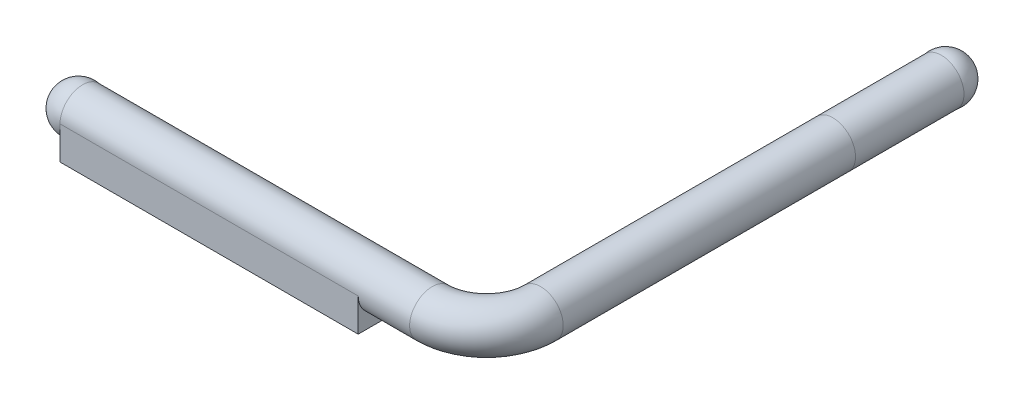
ISO-10303-21;
HEADER;
FILE_DESCRIPTION(('STEP AP214'),'2;1');
FILE_NAME('part.step','',(''),(''),'','','');
FILE_SCHEMA(('AUTOMOTIVE_DESIGN { 1 0 10303 214 1 1 1 1 }'));
ENDSEC;
DATA;
#1=APPLICATION_CONTEXT('core data for automotive mechanical design processes');
#2=APPLICATION_PROTOCOL_DEFINITION('international standard','automotive_design',2000,#1);
#3=PRODUCT_CONTEXT('',#1,'mechanical');
#4=PRODUCT('Part','Part','',(#3));
#5=PRODUCT_RELATED_PRODUCT_CATEGORY('part','',(#4));
#6=PRODUCT_DEFINITION_FORMATION('','',#4);
#7=PRODUCT_DEFINITION_CONTEXT('part definition',#1,'design');
#8=PRODUCT_DEFINITION('design','',#6,#7);
#9=PRODUCT_DEFINITION_SHAPE('','',#8);
#10=(LENGTH_UNIT() NAMED_UNIT(*) SI_UNIT(.MILLI.,.METRE.));
#11=(NAMED_UNIT(*) PLANE_ANGLE_UNIT() SI_UNIT($,.RADIAN.));
#12=(NAMED_UNIT(*) SI_UNIT($,.STERADIAN.) SOLID_ANGLE_UNIT());
#13=UNCERTAINTY_MEASURE_WITH_UNIT(LENGTH_MEASURE(1.E-05),#10,'distance_accuracy_value','');
#14=(GEOMETRIC_REPRESENTATION_CONTEXT(3) GLOBAL_UNCERTAINTY_ASSIGNED_CONTEXT((#13)) GLOBAL_UNIT_ASSIGNED_CONTEXT((#10,
#11,#12)) REPRESENTATION_CONTEXT('',''));
#15=CARTESIAN_POINT('',(0.,0.,0.));
#16=DIRECTION('',(0.,0.,1.));
#17=DIRECTION('',(1.,0.,0.));
#18=AXIS2_PLACEMENT_3D('',#15,#16,#17);
#19=CARTESIAN_POINT('',(25.,4.,32.35));
#20=DIRECTION('',(0.,0.,-1.));
#21=DIRECTION('',(-1.,0.,0.));
#22=AXIS2_PLACEMENT_3D('',#19,#20,#21);
#23=CYLINDRICAL_SURFACE('',#22,2.49999999999999);
#24=CARTESIAN_POINT('',(25.,4.,32.35));
#25=DIRECTION('',(0.,0.,1.));
#26=DIRECTION('',(1.,0.,0.));
#27=AXIS2_PLACEMENT_3D('',#24,#25,#26);
#28=CIRCLE('',#27,2.49999999999999);
#29=CARTESIAN_POINT('',(27.5,4.,32.35));
#30=VERTEX_POINT('',#29);
#31=EDGE_CURVE('E118',#30,#30,#28,.T.);
#32=ORIENTED_EDGE('',*,*,#31,.F.);
#33=EDGE_LOOP('',(#32));
#34=FACE_BOUND('',#33,.T.);
#35=CARTESIAN_POINT('',(25.,4.,0.));
#36=DIRECTION('',(0.,0.,1.));
#37=DIRECTION('',(1.,0.,0.));
#38=AXIS2_PLACEMENT_3D('',#35,#36,#37);
#39=CIRCLE('',#38,2.49999999999999);
#40=CARTESIAN_POINT('',(27.5,4.,0.));
#41=VERTEX_POINT('',#40);
#42=EDGE_CURVE('E11',#41,#41,#39,.T.);
#43=ORIENTED_EDGE('',*,*,#42,.T.);
#44=EDGE_LOOP('',(#43));
#45=FACE_BOUND('',#44,.T.);
#46=ADVANCED_FACE('F41',(#34,#45),#23,.T.);
#47=CARTESIAN_POINT('',(19.,4.,38.35));
#48=DIRECTION('',(-1.,0.,0.));
#49=DIRECTION('',(0.,0.,1.));
#50=AXIS2_PLACEMENT_3D('',#47,#48,#49);
#51=CYLINDRICAL_SURFACE('',#50,2.49999999999999);
#52=CARTESIAN_POINT('',(19.,4.,38.35));
#53=DIRECTION('',(-1.,0.,0.));
#54=DIRECTION('',(0.,0.,1.));
#55=AXIS2_PLACEMENT_3D('',#52,#53,#54);
#56=CIRCLE('',#55,2.49999999999999);
#57=CARTESIAN_POINT('',(19.,4.,40.85));
#58=VERTEX_POINT('',#57);
#59=EDGE_CURVE('E121',#58,#58,#56,.T.);
#60=ORIENTED_EDGE('',*,*,#59,.T.);
#61=EDGE_LOOP('',(#60));
#62=FACE_BOUND('',#61,.T.);
#63=CARTESIAN_POINT('',(-19.6899999999999,4.,38.35));
#64=DIRECTION('',(-1.,0.,0.));
#65=DIRECTION('',(0.,0.,1.));
#66=AXIS2_PLACEMENT_3D('',#63,#64,#65);
#67=CIRCLE('',#66,2.49999999999999);
#68=CARTESIAN_POINT('',(-19.6899999999999,4.,40.85));
#69=VERTEX_POINT('',#68);
#70=CARTESIAN_POINT('',(-19.6899999999999,4.,35.85));
#71=VERTEX_POINT('',#70);
#72=EDGE_CURVE('E49',#69,#71,#67,.T.);
#73=ORIENTED_EDGE('',*,*,#72,.F.);
#74=DIRECTION('',(-1.,0.,0.));
#75=VECTOR('',#74,1.);
#76=CARTESIAN_POINT('',(19.,4.,40.85));
#77=LINE('',#76,#75);
#78=CARTESIAN_POINT('',(13.3100000000001,4.,40.85));
#79=VERTEX_POINT('',#78);
#80=EDGE_CURVE('E56',#79,#69,#77,.T.);
#81=ORIENTED_EDGE('',*,*,#80,.F.);
#82=CARTESIAN_POINT('',(13.3100000000001,4.,38.35));
#83=DIRECTION('',(-1.,0.,0.));
#84=DIRECTION('',(0.,0.,1.));
#85=AXIS2_PLACEMENT_3D('',#82,#83,#84);
#86=CIRCLE('',#85,2.49999999999999);
#87=CARTESIAN_POINT('',(13.3100000000001,4.,35.85));
#88=VERTEX_POINT('',#87);
#89=EDGE_CURVE('E97',#88,#79,#86,.T.);
#90=ORIENTED_EDGE('',*,*,#89,.F.);
#91=DIRECTION('',(-1.,0.,0.));
#92=VECTOR('',#91,1.);
#93=CARTESIAN_POINT('',(19.,4.,35.85));
#94=LINE('',#93,#92);
#95=EDGE_CURVE('E87',#88,#71,#94,.T.);
#96=ORIENTED_EDGE('',*,*,#95,.T.);
#97=EDGE_LOOP('',(#73,#81,#90,#96));
#98=FACE_BOUND('',#97,.T.);
#99=ADVANCED_FACE('F141',(#62,#98),#51,.T.);
#100=CARTESIAN_POINT('',(19.,4.,32.35));
#101=DIRECTION('',(0.,-1.,0.));
#102=DIRECTION('',(0.,0.,-1.));
#103=AXIS2_PLACEMENT_3D('',#100,#101,#102);
#104=TOROIDAL_SURFACE('',#103,6.00000000000001,2.49999999999999);
#105=CARTESIAN_POINT('',(19.,4.,32.35));
#106=DIRECTION('',(0.,-1.,0.));
#107=DIRECTION('',(0.,0.,-1.));
#108=AXIS2_PLACEMENT_3D('',#105,#106,#107);
#109=CIRCLE('',#108,8.5);
#110=EDGE_CURVE('',#30,#58,#109,.T.);
#111=ORIENTED_EDGE('',*,*,#31,.T.);
#112=ORIENTED_EDGE('',*,*,#59,.F.);
#113=ORIENTED_EDGE('',*,*,#110,.T.);
#114=ORIENTED_EDGE('',*,*,#110,.F.);
#115=EDGE_LOOP('',(#111,#113,#112,#114));
#116=FACE_BOUND('',#115,.T.);
#117=ADVANCED_FACE('F148',(#116),#104,.T.);
#118=ORIENTED_EDGE('',*,*,#42,.F.);
#119=EDGE_LOOP('',(#118));
#120=FACE_BOUND('',#119,.T.);
#121=CARTESIAN_POINT('',(25.,4.,-12.));
#122=DIRECTION('',(0.,0.,1.));
#123=DIRECTION('',(1.,0.,0.));
#124=AXIS2_PLACEMENT_3D('',#121,#122,#123);
#125=CIRCLE('',#124,2.49999999999999);
#126=CARTESIAN_POINT('',(27.5,4.,-12.));
#127=VERTEX_POINT('',#126);
#128=EDGE_CURVE('E103',#127,#127,#125,.T.);
#129=ORIENTED_EDGE('',*,*,#128,.T.);
#130=EDGE_LOOP('',(#129));
#131=FACE_BOUND('',#130,.T.);
#132=ADVANCED_FACE('F128',(#120,#131),#23,.T.);
#133=CARTESIAN_POINT('',(-20.1483333333332,4.,38.35));
#134=DIRECTION('',(0.,0.,1.));
#135=DIRECTION('',(1.,0.,0.));
#136=AXIS2_PLACEMENT_3D('',#133,#134,#135);
#137=SPHERICAL_SURFACE('',#136,2.54166666666666);
#138=CARTESIAN_POINT('',(-20.1483333333332,4.,38.35));
#139=DIRECTION('',(-1.,0.,0.));
#140=DIRECTION('',(0.,0.,1.));
#141=AXIS2_PLACEMENT_3D('',#138,#139,#140);
#142=SPHERICAL_SURFACE('',#141,2.54166666666666);
#143=ORIENTED_EDGE('',*,*,#72,.T.);
#144=CARTESIAN_POINT('',(-19.6899999999999,4.,38.35));
#145=DIRECTION('',(1.,0.,0.));
#146=DIRECTION('',(0.,0.,-1.));
#147=AXIS2_PLACEMENT_3D('',#144,#145,#146);
#148=CIRCLE('',#147,2.49999999999999);
#149=EDGE_CURVE('E113',#69,#71,#148,.T.);
#150=ORIENTED_EDGE('',*,*,#149,.F.);
#151=EDGE_LOOP('',(#143,#150));
#152=FACE_BOUND('',#151,.T.);
#153=ADVANCED_FACE('F131',(#152),#142,.T.);
#154=CARTESIAN_POINT('',(25.,4.,-12.4583333333333));
#155=DIRECTION('',(0.,0.,1.));
#156=DIRECTION('',(1.,0.,0.));
#157=AXIS2_PLACEMENT_3D('',#154,#155,#156);
#158=SPHERICAL_SURFACE('',#157,2.54166666666666);
#159=ORIENTED_EDGE('',*,*,#128,.F.);
#160=EDGE_LOOP('',(#159));
#161=FACE_BOUND('',#160,.T.);
#162=ADVANCED_FACE('F43',(#161),#158,.T.);
#163=CARTESIAN_POINT('',(13.3100000000001,0.34,35.85));
#164=DIRECTION('',(0.,1.,0.));
#165=DIRECTION('',(0.,0.,1.));
#166=AXIS2_PLACEMENT_3D('',#163,#164,#165);
#167=PLANE('',#166);
#168=DIRECTION('',(0.,0.,-1.));
#169=VECTOR('',#168,1.);
#170=CARTESIAN_POINT('',(13.3100000000001,0.34,40.85));
#171=LINE('',#170,#169);
#172=CARTESIAN_POINT('',(13.3100000000001,0.34,40.85));
#173=VERTEX_POINT('',#172);
#174=CARTESIAN_POINT('',(13.3100000000001,0.34,35.85));
#175=VERTEX_POINT('',#174);
#176=EDGE_CURVE('E95',#173,#175,#171,.T.);
#177=ORIENTED_EDGE('',*,*,#176,.F.);
#178=DIRECTION('',(1.,0.,0.));
#179=VECTOR('',#178,1.);
#180=CARTESIAN_POINT('',(-19.6899999999999,0.34,40.85));
#181=LINE('',#180,#179);
#182=CARTESIAN_POINT('',(-19.6899999999999,0.34,40.85));
#183=VERTEX_POINT('',#182);
#184=EDGE_CURVE('E116',#183,#173,#181,.T.);
#185=ORIENTED_EDGE('',*,*,#184,.F.);
#186=DIRECTION('',(0.,0.,1.));
#187=VECTOR('',#186,1.);
#188=CARTESIAN_POINT('',(-19.6899999999999,0.34,35.85));
#189=LINE('',#188,#187);
#190=CARTESIAN_POINT('',(-19.6899999999999,0.34,35.85));
#191=VERTEX_POINT('',#190);
#192=EDGE_CURVE('E89',#191,#183,#189,.T.);
#193=ORIENTED_EDGE('',*,*,#192,.F.);
#194=DIRECTION('',(-1.,0.,0.));
#195=VECTOR('',#194,1.);
#196=CARTESIAN_POINT('',(13.3100000000001,0.34,35.85));
#197=LINE('',#196,#195);
#198=EDGE_CURVE('E84',#175,#191,#197,.T.);
#199=ORIENTED_EDGE('',*,*,#198,.F.);
#200=EDGE_LOOP('',(#177,#185,#193,#199));
#201=FACE_BOUND('',#200,.T.);
#202=ADVANCED_FACE('F93',(#201),#167,.F.);
#203=CARTESIAN_POINT('',(-19.6899999999999,6.54266666666667,40.85));
#204=DIRECTION('',(0.,0.,-1.));
#205=DIRECTION('',(-1.,0.,0.));
#206=AXIS2_PLACEMENT_3D('',#203,#204,#205);
#207=PLANE('',#206);
#208=DIRECTION('',(0.,-1.,0.));
#209=VECTOR('',#208,1.);
#210=CARTESIAN_POINT('',(13.3100000000001,6.54266666666667,40.85));
#211=LINE('',#210,#209);
#212=EDGE_CURVE('E100',#79,#173,#211,.T.);
#213=ORIENTED_EDGE('',*,*,#212,.F.);
#214=ORIENTED_EDGE('',*,*,#80,.T.);
#215=DIRECTION('',(0.,-1.,0.));
#216=VECTOR('',#215,1.);
#217=CARTESIAN_POINT('',(-19.6899999999999,6.54266666666667,40.85));
#218=LINE('',#217,#216);
#219=EDGE_CURVE('E108',#69,#183,#218,.T.);
#220=ORIENTED_EDGE('',*,*,#219,.T.);
#221=ORIENTED_EDGE('',*,*,#184,.T.);
#222=EDGE_LOOP('',(#213,#214,#220,#221));
#223=FACE_BOUND('',#222,.T.);
#224=ADVANCED_FACE('F137',(#223),#207,.F.);
#225=CARTESIAN_POINT('',(-19.6899999999999,6.54266666666667,35.85));
#226=DIRECTION('',(1.,0.,0.));
#227=DIRECTION('',(0.,0.,-1.));
#228=AXIS2_PLACEMENT_3D('',#225,#226,#227);
#229=PLANE('',#228);
#230=ORIENTED_EDGE('',*,*,#219,.F.);
#231=ORIENTED_EDGE('',*,*,#149,.T.);
#232=DIRECTION('',(0.,-1.,0.));
#233=VECTOR('',#232,1.);
#234=CARTESIAN_POINT('',(-19.6899999999999,6.54266666666667,35.85));
#235=LINE('',#234,#233);
#236=EDGE_CURVE('E111',#71,#191,#235,.T.);
#237=ORIENTED_EDGE('',*,*,#236,.T.);
#238=ORIENTED_EDGE('',*,*,#192,.T.);
#239=EDGE_LOOP('',(#230,#231,#237,#238));
#240=FACE_BOUND('',#239,.T.);
#241=ADVANCED_FACE('F170',(#240),#229,.F.);
#242=CARTESIAN_POINT('',(13.3100000000001,6.54266666666667,35.85));
#243=DIRECTION('',(0.,0.,1.));
#244=DIRECTION('',(1.,0.,0.));
#245=AXIS2_PLACEMENT_3D('',#242,#243,#244);
#246=PLANE('',#245);
#247=ORIENTED_EDGE('',*,*,#95,.F.);
#248=DIRECTION('',(0.,-1.,0.));
#249=VECTOR('',#248,1.);
#250=CARTESIAN_POINT('',(13.3100000000001,6.54266666666667,35.85));
#251=LINE('',#250,#249);
#252=EDGE_CURVE('E65',#88,#175,#251,.T.);
#253=ORIENTED_EDGE('',*,*,#252,.T.);
#254=ORIENTED_EDGE('',*,*,#198,.T.);
#255=ORIENTED_EDGE('',*,*,#236,.F.);
#256=EDGE_LOOP('',(#247,#253,#254,#255));
#257=FACE_BOUND('',#256,.T.);
#258=ADVANCED_FACE('F82',(#257),#246,.F.);
#259=CARTESIAN_POINT('',(13.3100000000001,6.54266666666667,40.85));
#260=DIRECTION('',(-1.,0.,0.));
#261=DIRECTION('',(0.,0.,1.));
#262=AXIS2_PLACEMENT_3D('',#259,#260,#261);
#263=PLANE('',#262);
#264=ORIENTED_EDGE('',*,*,#252,.F.);
#265=ORIENTED_EDGE('',*,*,#89,.T.);
#266=ORIENTED_EDGE('',*,*,#212,.T.);
#267=ORIENTED_EDGE('',*,*,#176,.T.);
#268=EDGE_LOOP('',(#264,#265,#266,#267));
#269=FACE_BOUND('',#268,.T.);
#270=ADVANCED_FACE('F99',(#269),#263,.F.);
#271=CLOSED_SHELL('',(#46,#99,#117,#132,#153,#162,#202,#224,#241,#258,#270));
#272=MANIFOLD_SOLID_BREP('B2',#271);
#273=ADVANCED_BREP_SHAPE_REPRESENTATION('',(#18,#272),#14);
#274=SHAPE_DEFINITION_REPRESENTATION(#9,#273);
ENDSEC;
END-ISO-10303-21;
